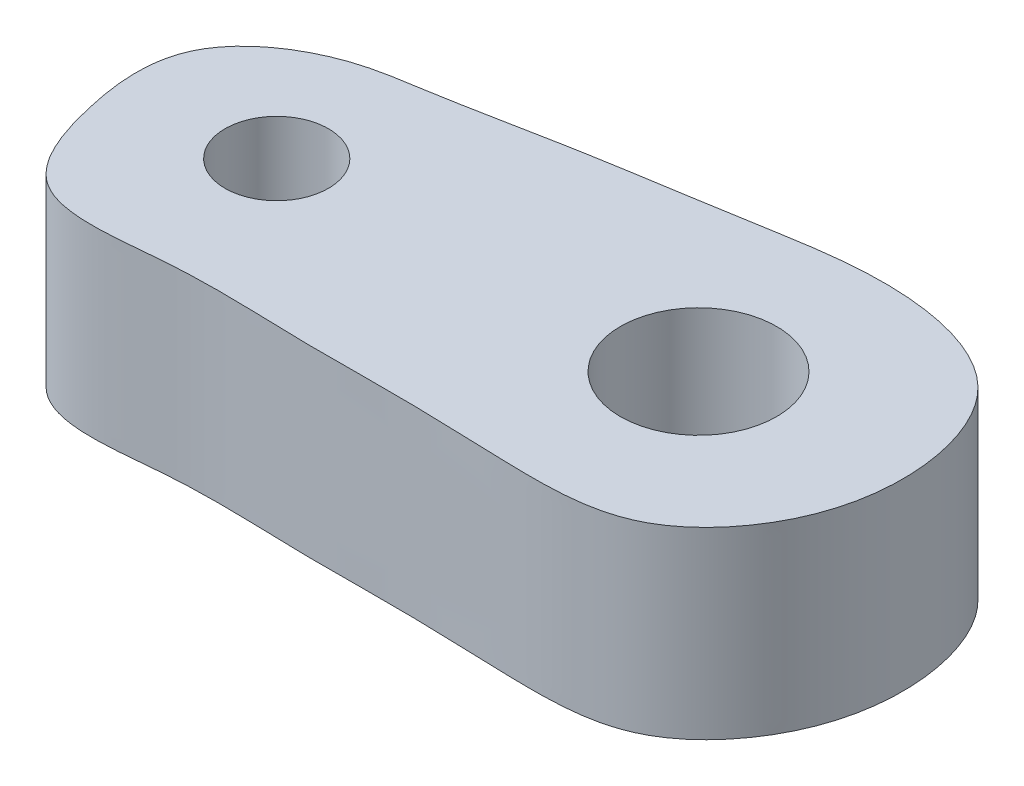
ISO-10303-21;
HEADER;
FILE_DESCRIPTION(('STEP AP214'),'2;1');
FILE_NAME('part.step','',(''),(''),'','','');
FILE_SCHEMA(('AUTOMOTIVE_DESIGN { 1 0 10303 214 1 1 1 1 }'));
ENDSEC;
DATA;
#1=APPLICATION_CONTEXT('core data for automotive mechanical design processes');
#2=APPLICATION_PROTOCOL_DEFINITION('international standard','automotive_design',2000,#1);
#3=PRODUCT_CONTEXT('',#1,'mechanical');
#4=PRODUCT('Part','Part','',(#3));
#5=PRODUCT_RELATED_PRODUCT_CATEGORY('part','',(#4));
#6=PRODUCT_DEFINITION_FORMATION('','',#4);
#7=PRODUCT_DEFINITION_CONTEXT('part definition',#1,'design');
#8=PRODUCT_DEFINITION('design','',#6,#7);
#9=PRODUCT_DEFINITION_SHAPE('','',#8);
#10=(LENGTH_UNIT() NAMED_UNIT(*) SI_UNIT(.MILLI.,.METRE.));
#11=(NAMED_UNIT(*) PLANE_ANGLE_UNIT() SI_UNIT($,.RADIAN.));
#12=(NAMED_UNIT(*) SI_UNIT($,.STERADIAN.) SOLID_ANGLE_UNIT());
#13=UNCERTAINTY_MEASURE_WITH_UNIT(LENGTH_MEASURE(1.E-05),#10,'distance_accuracy_value','');
#14=(GEOMETRIC_REPRESENTATION_CONTEXT(3) GLOBAL_UNCERTAINTY_ASSIGNED_CONTEXT((#13)) GLOBAL_UNIT_ASSIGNED_CONTEXT((#10,
#11,#12)) REPRESENTATION_CONTEXT('',''));
#15=CARTESIAN_POINT('',(0.,0.,0.));
#16=DIRECTION('',(0.,0.,1.));
#17=DIRECTION('',(1.,0.,0.));
#18=AXIS2_PLACEMENT_3D('',#15,#16,#17);
#19=CARTESIAN_POINT('',(-14.5387211558477,4.,-62.0200910063813));
#20=DIRECTION('',(0.,-1.,0.));
#21=DIRECTION('',(0.,0.,-1.));
#22=AXIS2_PLACEMENT_3D('',#19,#20,#21);
#23=PLANE('',#22);
#24=CARTESIAN_POINT('',(-24.1055985527137,4.,-68.0797360447558));
#25=CARTESIAN_POINT('',(-24.5029770257251,4.,-68.014599396419));
#26=CARTESIAN_POINT('',(-25.7279200453682,4.,-67.8409790659151));
#27=CARTESIAN_POINT('',(-27.7316250388632,4.,-66.563960319099));
#28=CARTESIAN_POINT('',(-27.4966898165548,4.,-64.1360410750109));
#29=CARTESIAN_POINT('',(-26.5781862390492,4.,-61.5986361195585));
#30=CARTESIAN_POINT('',(-23.4522362850659,4.,-62.1641122320427));
#31=CARTESIAN_POINT('',(-20.9271778768134,4.,-61.9875225189268));
#32=CARTESIAN_POINT('',(-18.3214974846968,4.,-62.0514552672992));
#33=CARTESIAN_POINT('',(-16.0245554321553,4.,-61.9295685363678));
#34=CARTESIAN_POINT('',(-13.639930097532,4.,-61.966009621055));
#35=CARTESIAN_POINT('',(-11.9243762668143,4.,-63.7027208983213));
#36=CARTESIAN_POINT('',(-11.2984871883963,4.,-66.0398130485137));
#37=CARTESIAN_POINT('',(-12.189891611871,4.,-69.0276247979381));
#38=CARTESIAN_POINT('',(-15.3512562170001,4.,-69.6453597442915));
#39=CARTESIAN_POINT('',(-18.2941374672918,4.,-69.0802533558578));
#40=CARTESIAN_POINT('',(-21.1965056957822,4.,-68.6570651616311));
#41=CARTESIAN_POINT('',(-23.2033003651733,4.,-68.2276370603578));
#42=CARTESIAN_POINT('',(-24.1055985527137,4.,-68.0797360447558));
#43=B_SPLINE_CURVE_WITH_KNOTS('',3,(#24,#25,#26,#27,#28,#29,#30,#31,#32,#33,#34,#35,#36,#37,#38,
#39,#40,#41,#42),.UNSPECIFIED.,.T.,.F.,(4,1,1,1,1,1,1,1,1,1,1,1,1,1,1,1,4),(0.,
0.0305407659586044,0.0943091639107685,0.150724953004655,0.201836978422771,0.27243676839629,
0.347806407777191,0.403225260263148,0.465316637558171,0.524097207155766,0.572714420081622,
0.636436461650284,0.700782021412871,0.780525494444124,0.846378390247837,0.930653320091262,1.),.UNSPECIFIED.);
#44=CARTESIAN_POINT('',(-24.1055985527137,4.,-68.0797360447558));
#45=VERTEX_POINT('',#44);
#46=EDGE_CURVE('E10',#45,#45,#43,.T.);
#47=ORIENTED_EDGE('',*,*,#46,.T.);
#48=EDGE_LOOP('',(#47));
#49=FACE_BOUND('',#48,.T.);
#50=CARTESIAN_POINT('',(-15.7934928509554,4.,-65.7585363142117));
#51=DIRECTION('',(0.,1.,0.));
#52=DIRECTION('',(0.,0.,1.));
#53=AXIS2_PLACEMENT_3D('',#50,#51,#52);
#54=CIRCLE('',#53,1.7);
#55=CARTESIAN_POINT('',(-15.7934928509554,4.,-64.0585363142116));
#56=VERTEX_POINT('',#55);
#57=EDGE_CURVE('E44',#56,#56,#54,.T.);
#58=ORIENTED_EDGE('',*,*,#57,.F.);
#59=EDGE_LOOP('',(#58));
#60=FACE_BOUND('',#59,.T.);
#61=CARTESIAN_POINT('',(-24.3929851860192,4.,-65.1837630476007));
#62=DIRECTION('',(0.,1.,0.));
#63=DIRECTION('',(0.,0.,1.));
#64=AXIS2_PLACEMENT_3D('',#61,#62,#63);
#65=CIRCLE('',#64,1.125);
#66=CARTESIAN_POINT('',(-24.3929851860192,4.,-64.0587630476007));
#67=VERTEX_POINT('',#66);
#68=EDGE_CURVE('E55',#67,#67,#65,.T.);
#69=ORIENTED_EDGE('',*,*,#68,.F.);
#70=EDGE_LOOP('',(#69));
#71=FACE_BOUND('',#70,.T.);
#72=ADVANCED_FACE('F31',(#49,#60,#71),#23,.F.);
#73=CARTESIAN_POINT('',(-14.5387211558477,0.,-62.0200910063813));
#74=DIRECTION('',(0.,-1.,0.));
#75=DIRECTION('',(0.,0.,-1.));
#76=AXIS2_PLACEMENT_3D('',#73,#74,#75);
#77=PLANE('',#76);
#78=CARTESIAN_POINT('',(-15.7934928509554,0.,-65.7585363142117));
#79=DIRECTION('',(0.,1.,0.));
#80=DIRECTION('',(0.,0.,1.));
#81=AXIS2_PLACEMENT_3D('',#78,#79,#80);
#82=CIRCLE('',#81,1.7);
#83=CARTESIAN_POINT('',(-15.7934928509554,0.,-64.0585363142116));
#84=VERTEX_POINT('',#83);
#85=EDGE_CURVE('E49',#84,#84,#82,.T.);
#86=ORIENTED_EDGE('',*,*,#85,.T.);
#87=EDGE_LOOP('',(#86));
#88=FACE_BOUND('',#87,.T.);
#89=CARTESIAN_POINT('',(-24.1055985527137,0.,-68.0797360447558));
#90=CARTESIAN_POINT('',(-24.5029770257251,0.,-68.014599396419));
#91=CARTESIAN_POINT('',(-25.7279200453682,0.,-67.8409790659151));
#92=CARTESIAN_POINT('',(-27.7316250388632,0.,-66.563960319099));
#93=CARTESIAN_POINT('',(-27.4966898165548,0.,-64.1360410750109));
#94=CARTESIAN_POINT('',(-26.5781862390492,0.,-61.5986361195585));
#95=CARTESIAN_POINT('',(-23.4522362850659,0.,-62.1641122320427));
#96=CARTESIAN_POINT('',(-20.9271778768134,0.,-61.9875225189268));
#97=CARTESIAN_POINT('',(-18.3214974846968,0.,-62.0514552672992));
#98=CARTESIAN_POINT('',(-16.0245554321553,0.,-61.9295685363678));
#99=CARTESIAN_POINT('',(-13.639930097532,0.,-61.966009621055));
#100=CARTESIAN_POINT('',(-11.9243762668143,0.,-63.7027208983213));
#101=CARTESIAN_POINT('',(-11.2984871883963,0.,-66.0398130485137));
#102=CARTESIAN_POINT('',(-12.189891611871,0.,-69.0276247979381));
#103=CARTESIAN_POINT('',(-15.3512562170001,0.,-69.6453597442915));
#104=CARTESIAN_POINT('',(-18.2941374672918,0.,-69.0802533558578));
#105=CARTESIAN_POINT('',(-21.1965056957822,0.,-68.6570651616311));
#106=CARTESIAN_POINT('',(-23.2033003651733,0.,-68.2276370603578));
#107=CARTESIAN_POINT('',(-24.1055985527137,0.,-68.0797360447558));
#108=B_SPLINE_CURVE_WITH_KNOTS('',3,(#89,#90,#91,#92,#93,#94,#95,#96,#97,#98,#99,#100,#101,#102,
#103,#104,#105,#106,#107),.UNSPECIFIED.,.T.,.F.,(4,1,1,1,1,1,1,1,1,1,1,1,1,1,1,1,4),(0.,
0.0305407659586044,0.0943091639107685,0.150724953004655,0.201836978422771,0.27243676839629,
0.347806407777191,0.403225260263148,0.465316637558171,0.524097207155766,0.572714420081622,
0.636436461650284,0.700782021412871,0.780525494444124,0.846378390247837,0.930653320091262,1.),.UNSPECIFIED.);
#109=CARTESIAN_POINT('',(-24.1055985527137,0.,-68.0797360447558));
#110=VERTEX_POINT('',#109);
#111=EDGE_CURVE('E36',#110,#110,#108,.T.);
#112=ORIENTED_EDGE('',*,*,#111,.F.);
#113=EDGE_LOOP('',(#112));
#114=FACE_BOUND('',#113,.T.);
#115=CARTESIAN_POINT('',(-24.3929851860192,0.,-65.1837630476007));
#116=DIRECTION('',(0.,1.,0.));
#117=DIRECTION('',(0.,0.,1.));
#118=AXIS2_PLACEMENT_3D('',#115,#116,#117);
#119=CIRCLE('',#118,1.125);
#120=CARTESIAN_POINT('',(-24.3929851860192,0.,-64.0587630476007));
#121=VERTEX_POINT('',#120);
#122=EDGE_CURVE('E58',#121,#121,#119,.T.);
#123=ORIENTED_EDGE('',*,*,#122,.T.);
#124=EDGE_LOOP('',(#123));
#125=FACE_BOUND('',#124,.T.);
#126=ADVANCED_FACE('F68',(#88,#114,#125),#77,.T.);
#127=DIRECTION('',(0.,-1.,0.));
#128=VECTOR('',#127,1.);
#129=SURFACE_OF_LINEAR_EXTRUSION('',#43,#128);
#130=ORIENTED_EDGE('',*,*,#46,.F.);
#131=EDGE_LOOP('',(#130));
#132=FACE_BOUND('',#131,.T.);
#133=ORIENTED_EDGE('',*,*,#111,.T.);
#134=EDGE_LOOP('',(#133));
#135=FACE_BOUND('',#134,.T.);
#136=ADVANCED_FACE('F33',(#132,#135),#129,.F.);
#137=CARTESIAN_POINT('',(-15.7934928509554,4.,-65.7585363142117));
#138=DIRECTION('',(0.,-1.,0.));
#139=DIRECTION('',(0.,0.,-1.));
#140=AXIS2_PLACEMENT_3D('',#137,#138,#139);
#141=CYLINDRICAL_SURFACE('',#140,1.7);
#142=ORIENTED_EDGE('',*,*,#57,.T.);
#143=EDGE_LOOP('',(#142));
#144=FACE_BOUND('',#143,.T.);
#145=ORIENTED_EDGE('',*,*,#85,.F.);
#146=EDGE_LOOP('',(#145));
#147=FACE_BOUND('',#146,.T.);
#148=ADVANCED_FACE('F76',(#144,#147),#141,.F.);
#149=CARTESIAN_POINT('',(-24.3929851860192,4.,-65.1837630476007));
#150=DIRECTION('',(0.,-1.,0.));
#151=DIRECTION('',(0.,0.,-1.));
#152=AXIS2_PLACEMENT_3D('',#149,#150,#151);
#153=CYLINDRICAL_SURFACE('',#152,1.125);
#154=ORIENTED_EDGE('',*,*,#68,.T.);
#155=EDGE_LOOP('',(#154));
#156=FACE_BOUND('',#155,.T.);
#157=ORIENTED_EDGE('',*,*,#122,.F.);
#158=EDGE_LOOP('',(#157));
#159=FACE_BOUND('',#158,.T.);
#160=ADVANCED_FACE('F64',(#156,#159),#153,.F.);
#161=CLOSED_SHELL('',(#72,#126,#136,#148,#160));
#162=MANIFOLD_SOLID_BREP('B2',#161);
#163=ADVANCED_BREP_SHAPE_REPRESENTATION('',(#18,#162),#14);
#164=SHAPE_DEFINITION_REPRESENTATION(#9,#163);
ENDSEC;
END-ISO-10303-21;
